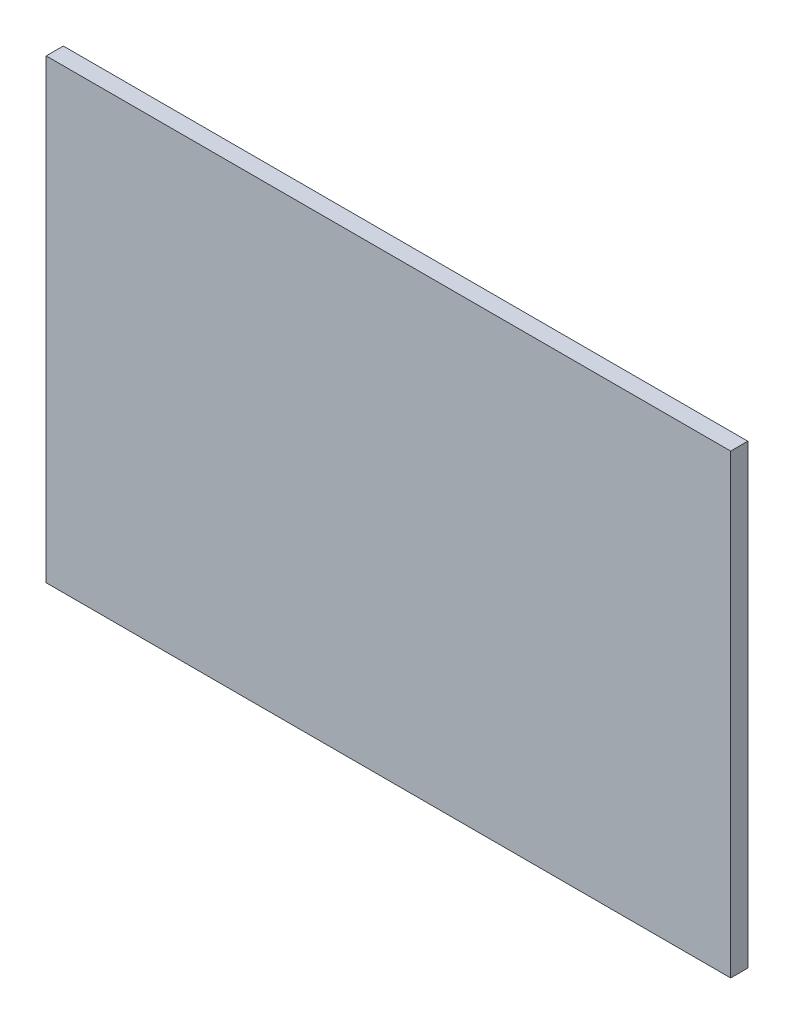
ISO-10303-21;
HEADER;
FILE_DESCRIPTION(('STEP AP214'),'2;1');
FILE_NAME('part.step','',(''),(''),'','','');
FILE_SCHEMA(('AUTOMOTIVE_DESIGN { 1 0 10303 214 1 1 1 1 }'));
ENDSEC;
DATA;
#1=APPLICATION_CONTEXT('core data for automotive mechanical design processes');
#2=APPLICATION_PROTOCOL_DEFINITION('international standard','automotive_design',2000,#1);
#3=PRODUCT_CONTEXT('',#1,'mechanical');
#4=PRODUCT('Part','Part','',(#3));
#5=PRODUCT_RELATED_PRODUCT_CATEGORY('part','',(#4));
#6=PRODUCT_DEFINITION_FORMATION('','',#4);
#7=PRODUCT_DEFINITION_CONTEXT('part definition',#1,'design');
#8=PRODUCT_DEFINITION('design','',#6,#7);
#9=PRODUCT_DEFINITION_SHAPE('','',#8);
#10=(LENGTH_UNIT() NAMED_UNIT(*) SI_UNIT(.MILLI.,.METRE.));
#11=(NAMED_UNIT(*) PLANE_ANGLE_UNIT() SI_UNIT($,.RADIAN.));
#12=(NAMED_UNIT(*) SI_UNIT($,.STERADIAN.) SOLID_ANGLE_UNIT());
#13=UNCERTAINTY_MEASURE_WITH_UNIT(LENGTH_MEASURE(1.E-05),#10,'distance_accuracy_value','');
#14=(GEOMETRIC_REPRESENTATION_CONTEXT(3) GLOBAL_UNCERTAINTY_ASSIGNED_CONTEXT((#13)) GLOBAL_UNIT_ASSIGNED_CONTEXT((#10,
#11,#12)) REPRESENTATION_CONTEXT('',''));
#15=CARTESIAN_POINT('',(0.,0.,0.));
#16=DIRECTION('',(0.,0.,1.));
#17=DIRECTION('',(1.,0.,0.));
#18=AXIS2_PLACEMENT_3D('',#15,#16,#17);
#19=CARTESIAN_POINT('',(-300.,-200.,15.));
#20=DIRECTION('',(1.,0.,0.));
#21=DIRECTION('',(0.,0.,-1.));
#22=AXIS2_PLACEMENT_3D('',#19,#20,#21);
#23=PLANE('',#22);
#24=DIRECTION('',(0.,-1.,0.));
#25=VECTOR('',#24,1.);
#26=CARTESIAN_POINT('',(-300.,-200.,0.));
#27=LINE('',#26,#25);
#28=CARTESIAN_POINT('',(-300.,200.,0.));
#29=VERTEX_POINT('',#28);
#30=CARTESIAN_POINT('',(-300.,-200.,0.));
#31=VERTEX_POINT('',#30);
#32=EDGE_CURVE('E100',#29,#31,#27,.T.);
#33=ORIENTED_EDGE('',*,*,#32,.T.);
#34=DIRECTION('',(0.,0.,-1.));
#35=VECTOR('',#34,1.);
#36=CARTESIAN_POINT('',(-300.,-200.,15.));
#37=LINE('',#36,#35);
#38=CARTESIAN_POINT('',(-300.,-200.,15.));
#39=VERTEX_POINT('',#38);
#40=EDGE_CURVE('E11',#39,#31,#37,.T.);
#41=ORIENTED_EDGE('',*,*,#40,.F.);
#42=DIRECTION('',(0.,-1.,0.));
#43=VECTOR('',#42,1.);
#44=CARTESIAN_POINT('',(-300.,-200.,15.));
#45=LINE('',#44,#43);
#46=CARTESIAN_POINT('',(-300.,200.,15.));
#47=VERTEX_POINT('',#46);
#48=EDGE_CURVE('E88',#47,#39,#45,.T.);
#49=ORIENTED_EDGE('',*,*,#48,.F.);
#50=DIRECTION('',(0.,0.,-1.));
#51=VECTOR('',#50,1.);
#52=CARTESIAN_POINT('',(-300.,200.,15.));
#53=LINE('',#52,#51);
#54=EDGE_CURVE('E96',#47,#29,#53,.T.);
#55=ORIENTED_EDGE('',*,*,#54,.T.);
#56=EDGE_LOOP('',(#33,#41,#49,#55));
#57=FACE_BOUND('',#56,.T.);
#58=ADVANCED_FACE('F37',(#57),#23,.F.);
#59=CARTESIAN_POINT('',(300.,-200.,15.));
#60=DIRECTION('',(0.,1.,0.));
#61=DIRECTION('',(-1.,0.,0.));
#62=AXIS2_PLACEMENT_3D('',#59,#60,#61);
#63=PLANE('',#62);
#64=DIRECTION('',(1.,0.,0.));
#65=VECTOR('',#64,1.);
#66=CARTESIAN_POINT('',(300.,-200.,0.));
#67=LINE('',#66,#65);
#68=CARTESIAN_POINT('',(300.,-200.,0.));
#69=VERTEX_POINT('',#68);
#70=EDGE_CURVE('E92',#31,#69,#67,.T.);
#71=ORIENTED_EDGE('',*,*,#70,.T.);
#72=DIRECTION('',(0.,0.,-1.));
#73=VECTOR('',#72,1.);
#74=CARTESIAN_POINT('',(300.,-200.,15.));
#75=LINE('',#74,#73);
#76=CARTESIAN_POINT('',(300.,-200.,15.));
#77=VERTEX_POINT('',#76);
#78=EDGE_CURVE('E45',#77,#69,#75,.T.);
#79=ORIENTED_EDGE('',*,*,#78,.F.);
#80=DIRECTION('',(1.,0.,0.));
#81=VECTOR('',#80,1.);
#82=CARTESIAN_POINT('',(300.,-200.,15.));
#83=LINE('',#82,#81);
#84=EDGE_CURVE('E83',#39,#77,#83,.T.);
#85=ORIENTED_EDGE('',*,*,#84,.F.);
#86=ORIENTED_EDGE('',*,*,#40,.T.);
#87=EDGE_LOOP('',(#71,#79,#85,#86));
#88=FACE_BOUND('',#87,.T.);
#89=ADVANCED_FACE('F91',(#88),#63,.F.);
#90=CARTESIAN_POINT('',(300.,-200.,15.));
#91=DIRECTION('',(-1.,0.,0.));
#92=DIRECTION('',(0.,0.,1.));
#93=AXIS2_PLACEMENT_3D('',#90,#91,#92);
#94=PLANE('',#93);
#95=DIRECTION('',(0.,1.,0.));
#96=VECTOR('',#95,1.);
#97=CARTESIAN_POINT('',(300.,-200.,0.));
#98=LINE('',#97,#96);
#99=CARTESIAN_POINT('',(300.,200.,0.));
#100=VERTEX_POINT('',#99);
#101=EDGE_CURVE('E70',#69,#100,#98,.T.);
#102=ORIENTED_EDGE('',*,*,#101,.T.);
#103=DIRECTION('',(0.,0.,-1.));
#104=VECTOR('',#103,1.);
#105=CARTESIAN_POINT('',(300.,200.,15.));
#106=LINE('',#105,#104);
#107=CARTESIAN_POINT('',(300.,200.,15.));
#108=VERTEX_POINT('',#107);
#109=EDGE_CURVE('E93',#108,#100,#106,.T.);
#110=ORIENTED_EDGE('',*,*,#109,.F.);
#111=DIRECTION('',(0.,1.,0.));
#112=VECTOR('',#111,1.);
#113=CARTESIAN_POINT('',(300.,-200.,15.));
#114=LINE('',#113,#112);
#115=EDGE_CURVE('E86',#77,#108,#114,.T.);
#116=ORIENTED_EDGE('',*,*,#115,.F.);
#117=ORIENTED_EDGE('',*,*,#78,.T.);
#118=EDGE_LOOP('',(#102,#110,#116,#117));
#119=FACE_BOUND('',#118,.T.);
#120=ADVANCED_FACE('F94',(#119),#94,.F.);
#121=CARTESIAN_POINT('',(300.,200.,15.));
#122=DIRECTION('',(0.,-1.,0.));
#123=DIRECTION('',(1.,0.,0.));
#124=AXIS2_PLACEMENT_3D('',#121,#122,#123);
#125=PLANE('',#124);
#126=DIRECTION('',(-1.,0.,0.));
#127=VECTOR('',#126,1.);
#128=CARTESIAN_POINT('',(300.,200.,0.));
#129=LINE('',#128,#127);
#130=EDGE_CURVE('E76',#100,#29,#129,.T.);
#131=ORIENTED_EDGE('',*,*,#130,.T.);
#132=ORIENTED_EDGE('',*,*,#54,.F.);
#133=DIRECTION('',(-1.,0.,0.));
#134=VECTOR('',#133,1.);
#135=CARTESIAN_POINT('',(300.,200.,15.));
#136=LINE('',#135,#134);
#137=EDGE_CURVE('E53',#108,#47,#136,.T.);
#138=ORIENTED_EDGE('',*,*,#137,.F.);
#139=ORIENTED_EDGE('',*,*,#109,.T.);
#140=EDGE_LOOP('',(#131,#132,#138,#139));
#141=FACE_BOUND('',#140,.T.);
#142=ADVANCED_FACE('F107',(#141),#125,.F.);
#143=CARTESIAN_POINT('',(0.,0.,15.));
#144=DIRECTION('',(0.,0.,1.));
#145=DIRECTION('',(1.,0.,0.));
#146=AXIS2_PLACEMENT_3D('',#143,#144,#145);
#147=PLANE('',#146);
#148=ORIENTED_EDGE('',*,*,#48,.T.);
#149=ORIENTED_EDGE('',*,*,#84,.T.);
#150=ORIENTED_EDGE('',*,*,#115,.T.);
#151=ORIENTED_EDGE('',*,*,#137,.T.);
#152=EDGE_LOOP('',(#148,#149,#150,#151));
#153=FACE_BOUND('',#152,.T.);
#154=ADVANCED_FACE('F84',(#153),#147,.T.);
#155=CARTESIAN_POINT('',(0.,0.,0.));
#156=DIRECTION('',(0.,0.,1.));
#157=DIRECTION('',(1.,0.,0.));
#158=AXIS2_PLACEMENT_3D('',#155,#156,#157);
#159=PLANE('',#158);
#160=ORIENTED_EDGE('',*,*,#32,.F.);
#161=ORIENTED_EDGE('',*,*,#130,.F.);
#162=ORIENTED_EDGE('',*,*,#101,.F.);
#163=ORIENTED_EDGE('',*,*,#70,.F.);
#164=EDGE_LOOP('',(#160,#161,#162,#163));
#165=FACE_BOUND('',#164,.T.);
#166=ADVANCED_FACE('F110',(#165),#159,.F.);
#167=CLOSED_SHELL('',(#58,#89,#120,#142,#154,#166));
#168=MANIFOLD_SOLID_BREP('B2',#167);
#169=ADVANCED_BREP_SHAPE_REPRESENTATION('',(#18,#168),#14);
#170=SHAPE_DEFINITION_REPRESENTATION(#9,#169);
ENDSEC;
END-ISO-10303-21;
